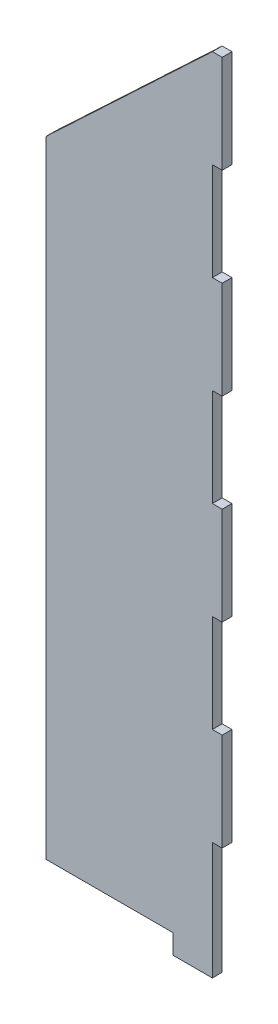
ISO-10303-21;
HEADER;
FILE_DESCRIPTION(('STEP AP214'),'2;1');
FILE_NAME('part.step','',(''),(''),'','','');
FILE_SCHEMA(('AUTOMOTIVE_DESIGN { 1 0 10303 214 1 1 1 1 }'));
ENDSEC;
DATA;
#1=APPLICATION_CONTEXT('core data for automotive mechanical design processes');
#2=APPLICATION_PROTOCOL_DEFINITION('international standard','automotive_design',2000,#1);
#3=PRODUCT_CONTEXT('',#1,'mechanical');
#4=PRODUCT('Part','Part','',(#3));
#5=PRODUCT_RELATED_PRODUCT_CATEGORY('part','',(#4));
#6=PRODUCT_DEFINITION_FORMATION('','',#4);
#7=PRODUCT_DEFINITION_CONTEXT('part definition',#1,'design');
#8=PRODUCT_DEFINITION('design','',#6,#7);
#9=PRODUCT_DEFINITION_SHAPE('','',#8);
#10=(LENGTH_UNIT() NAMED_UNIT(*) SI_UNIT(.MILLI.,.METRE.));
#11=(NAMED_UNIT(*) PLANE_ANGLE_UNIT() SI_UNIT($,.RADIAN.));
#12=(NAMED_UNIT(*) SI_UNIT($,.STERADIAN.) SOLID_ANGLE_UNIT());
#13=UNCERTAINTY_MEASURE_WITH_UNIT(LENGTH_MEASURE(1.E-05),#10,'distance_accuracy_value','');
#14=(GEOMETRIC_REPRESENTATION_CONTEXT(3) GLOBAL_UNCERTAINTY_ASSIGNED_CONTEXT((#13)) GLOBAL_UNIT_ASSIGNED_CONTEXT((#10,
#11,#12)) REPRESENTATION_CONTEXT('',''));
#15=CARTESIAN_POINT('',(0.,0.,0.));
#16=DIRECTION('',(0.,0.,1.));
#17=DIRECTION('',(1.,0.,0.));
#18=AXIS2_PLACEMENT_3D('',#15,#16,#17);
#19=CARTESIAN_POINT('',(-5.55111512312574E-13,25.3999999999994,3.175));
#20=DIRECTION('',(0.,1.,0.));
#21=DIRECTION('',(-1.,0.,0.));
#22=AXIS2_PLACEMENT_3D('',#19,#20,#21);
#23=PLANE('',#22);
#24=DIRECTION('',(1.,0.,0.));
#25=VECTOR('',#24,1.);
#26=CARTESIAN_POINT('',(-5.55111512312574E-13,25.3999999999994,0.));
#27=LINE('',#26,#25);
#28=CARTESIAN_POINT('',(26.9875,25.4,0.));
#29=VERTEX_POINT('',#28);
#30=CARTESIAN_POINT('',(30.162500000001,25.4,0.));
#31=VERTEX_POINT('',#30);
#32=EDGE_CURVE('E307',#29,#31,#27,.T.);
#33=ORIENTED_EDGE('',*,*,#32,.F.);
#34=DIRECTION('',(0.,0.,-1.));
#35=VECTOR('',#34,1.);
#36=CARTESIAN_POINT('',(26.9875,25.4,3.175));
#37=LINE('',#36,#35);
#38=CARTESIAN_POINT('',(26.9875,25.4,3.175));
#39=VERTEX_POINT('',#38);
#40=EDGE_CURVE('E11',#39,#29,#37,.T.);
#41=ORIENTED_EDGE('',*,*,#40,.F.);
#42=DIRECTION('',(1.,0.,0.));
#43=VECTOR('',#42,1.);
#44=CARTESIAN_POINT('',(-5.55111512312574E-13,25.3999999999994,3.175));
#45=LINE('',#44,#43);
#46=CARTESIAN_POINT('',(30.162500000001,25.4,3.175));
#47=VERTEX_POINT('',#46);
#48=EDGE_CURVE('E246',#39,#47,#45,.T.);
#49=ORIENTED_EDGE('',*,*,#48,.T.);
#50=DIRECTION('',(0.,0.,-1.));
#51=VECTOR('',#50,1.);
#52=CARTESIAN_POINT('',(30.162500000001,25.4,3.175));
#53=LINE('',#52,#51);
#54=EDGE_CURVE('E50',#47,#31,#53,.T.);
#55=ORIENTED_EDGE('',*,*,#54,.T.);
#56=EDGE_LOOP('',(#33,#41,#49,#55));
#57=FACE_BOUND('',#56,.T.);
#58=ADVANCED_FACE('F34',(#57),#23,.T.);
#59=CARTESIAN_POINT('',(26.9875,0.,3.175));
#60=DIRECTION('',(1.,0.,0.));
#61=DIRECTION('',(0.,1.,0.));
#62=AXIS2_PLACEMENT_3D('',#59,#60,#61);
#63=PLANE('',#62);
#64=DIRECTION('',(0.,-1.,0.));
#65=VECTOR('',#64,1.);
#66=CARTESIAN_POINT('',(26.9875,0.,0.));
#67=LINE('',#66,#65);
#68=CARTESIAN_POINT('',(26.9875,57.15,0.));
#69=VERTEX_POINT('',#68);
#70=EDGE_CURVE('E301',#69,#29,#67,.T.);
#71=ORIENTED_EDGE('',*,*,#70,.F.);
#72=DIRECTION('',(0.,0.,-1.));
#73=VECTOR('',#72,1.);
#74=CARTESIAN_POINT('',(26.9875,57.15,3.175));
#75=LINE('',#74,#73);
#76=CARTESIAN_POINT('',(26.9875,57.15,3.175));
#77=VERTEX_POINT('',#76);
#78=EDGE_CURVE('E42',#77,#69,#75,.T.);
#79=ORIENTED_EDGE('',*,*,#78,.F.);
#80=DIRECTION('',(0.,-1.,0.));
#81=VECTOR('',#80,1.);
#82=CARTESIAN_POINT('',(26.9875,0.,3.175));
#83=LINE('',#82,#81);
#84=EDGE_CURVE('E243',#77,#39,#83,.T.);
#85=ORIENTED_EDGE('',*,*,#84,.T.);
#86=ORIENTED_EDGE('',*,*,#40,.T.);
#87=EDGE_LOOP('',(#71,#79,#85,#86));
#88=FACE_BOUND('',#87,.T.);
#89=ADVANCED_FACE('F306',(#88),#63,.T.);
#90=CARTESIAN_POINT('',(-7.49400541621988E-13,57.1499999999996,3.175));
#91=DIRECTION('',(0.,1.,0.));
#92=DIRECTION('',(-1.,0.,0.));
#93=AXIS2_PLACEMENT_3D('',#90,#91,#92);
#94=PLANE('',#93);
#95=DIRECTION('',(1.,0.,0.));
#96=VECTOR('',#95,1.);
#97=CARTESIAN_POINT('',(-7.49400541621988E-13,57.1499999999996,0.));
#98=LINE('',#97,#96);
#99=CARTESIAN_POINT('',(30.1625000000007,57.15,0.));
#100=VERTEX_POINT('',#99);
#101=EDGE_CURVE('E294',#69,#100,#98,.T.);
#102=ORIENTED_EDGE('',*,*,#101,.T.);
#103=DIRECTION('',(0.,0.,-1.));
#104=VECTOR('',#103,1.);
#105=CARTESIAN_POINT('',(30.1625000000007,57.15,3.175));
#106=LINE('',#105,#104);
#107=CARTESIAN_POINT('',(30.1625000000007,57.15,3.175));
#108=VERTEX_POINT('',#107);
#109=EDGE_CURVE('E287',#108,#100,#106,.T.);
#110=ORIENTED_EDGE('',*,*,#109,.F.);
#111=DIRECTION('',(1.,0.,0.));
#112=VECTOR('',#111,1.);
#113=CARTESIAN_POINT('',(-7.49400541621988E-13,57.1499999999996,3.175));
#114=LINE('',#113,#112);
#115=EDGE_CURVE('E241',#77,#108,#114,.T.);
#116=ORIENTED_EDGE('',*,*,#115,.F.);
#117=ORIENTED_EDGE('',*,*,#78,.T.);
#118=EDGE_LOOP('',(#102,#110,#116,#117));
#119=FACE_BOUND('',#118,.T.);
#120=ADVANCED_FACE('F292',(#119),#94,.F.);
#121=CARTESIAN_POINT('',(30.1625000000007,0.,3.175));
#122=DIRECTION('',(1.,0.,0.));
#123=DIRECTION('',(0.,1.,0.));
#124=AXIS2_PLACEMENT_3D('',#121,#122,#123);
#125=PLANE('',#124);
#126=DIRECTION('',(0.,-1.,0.));
#127=VECTOR('',#126,1.);
#128=CARTESIAN_POINT('',(30.1625000000007,0.,0.));
#129=LINE('',#128,#127);
#130=CARTESIAN_POINT('',(30.1625000000003,88.9,0.));
#131=VERTEX_POINT('',#130);
#132=EDGE_CURVE('E304',#131,#100,#129,.T.);
#133=ORIENTED_EDGE('',*,*,#132,.F.);
#134=DIRECTION('',(0.,0.,-1.));
#135=VECTOR('',#134,1.);
#136=CARTESIAN_POINT('',(30.1625000000003,88.9,3.175));
#137=LINE('',#136,#135);
#138=CARTESIAN_POINT('',(30.1625000000003,88.9,3.175));
#139=VERTEX_POINT('',#138);
#140=EDGE_CURVE('E285',#139,#131,#137,.T.);
#141=ORIENTED_EDGE('',*,*,#140,.F.);
#142=DIRECTION('',(0.,-1.,0.));
#143=VECTOR('',#142,1.);
#144=CARTESIAN_POINT('',(30.1625000000007,0.,3.175));
#145=LINE('',#144,#143);
#146=EDGE_CURVE('E238',#139,#108,#145,.T.);
#147=ORIENTED_EDGE('',*,*,#146,.T.);
#148=ORIENTED_EDGE('',*,*,#109,.T.);
#149=EDGE_LOOP('',(#133,#141,#147,#148));
#150=FACE_BOUND('',#149,.T.);
#151=ADVANCED_FACE('F405',(#150),#125,.T.);
#152=CARTESIAN_POINT('',(-3.88578058618811E-13,88.8999999999999,3.175));
#153=DIRECTION('',(0.,1.,0.));
#154=DIRECTION('',(-1.,0.,0.));
#155=AXIS2_PLACEMENT_3D('',#152,#153,#154);
#156=PLANE('',#155);
#157=DIRECTION('',(1.,0.,0.));
#158=VECTOR('',#157,1.);
#159=CARTESIAN_POINT('',(-3.88578058618811E-13,88.8999999999999,0.));
#160=LINE('',#159,#158);
#161=CARTESIAN_POINT('',(26.9875,88.9,0.));
#162=VERTEX_POINT('',#161);
#163=EDGE_CURVE('E313',#162,#131,#160,.T.);
#164=ORIENTED_EDGE('',*,*,#163,.F.);
#165=DIRECTION('',(0.,0.,-1.));
#166=VECTOR('',#165,1.);
#167=CARTESIAN_POINT('',(26.9875,88.9,3.175));
#168=LINE('',#167,#166);
#169=CARTESIAN_POINT('',(26.9875,88.9,3.175));
#170=VERTEX_POINT('',#169);
#171=EDGE_CURVE('E283',#170,#162,#168,.T.);
#172=ORIENTED_EDGE('',*,*,#171,.F.);
#173=DIRECTION('',(1.,0.,0.));
#174=VECTOR('',#173,1.);
#175=CARTESIAN_POINT('',(-3.88578058618811E-13,88.8999999999999,3.175));
#176=LINE('',#175,#174);
#177=EDGE_CURVE('E235',#170,#139,#176,.T.);
#178=ORIENTED_EDGE('',*,*,#177,.T.);
#179=ORIENTED_EDGE('',*,*,#140,.T.);
#180=EDGE_LOOP('',(#164,#172,#178,#179));
#181=FACE_BOUND('',#180,.T.);
#182=ADVANCED_FACE('F402',(#181),#156,.T.);
#183=CARTESIAN_POINT('',(26.9875,120.65,0.));
#184=VERTEX_POINT('',#183);
#185=EDGE_CURVE('E309',#184,#162,#67,.T.);
#186=ORIENTED_EDGE('',*,*,#185,.F.);
#187=DIRECTION('',(0.,0.,-1.));
#188=VECTOR('',#187,1.);
#189=CARTESIAN_POINT('',(26.9875,120.65,3.175));
#190=LINE('',#189,#188);
#191=CARTESIAN_POINT('',(26.9875,120.65,3.175));
#192=VERTEX_POINT('',#191);
#193=EDGE_CURVE('E281',#192,#184,#190,.T.);
#194=ORIENTED_EDGE('',*,*,#193,.F.);
#195=EDGE_CURVE('E234',#192,#170,#83,.T.);
#196=ORIENTED_EDGE('',*,*,#195,.T.);
#197=ORIENTED_EDGE('',*,*,#171,.T.);
#198=EDGE_LOOP('',(#186,#194,#196,#197));
#199=FACE_BOUND('',#198,.T.);
#200=ADVANCED_FACE('F396',(#199),#63,.T.);
#201=CARTESIAN_POINT('',(-2.6367796834852E-12,120.649999999999,3.175));
#202=DIRECTION('',(0.,1.,0.));
#203=DIRECTION('',(-1.,0.,0.));
#204=AXIS2_PLACEMENT_3D('',#201,#202,#203);
#205=PLANE('',#204);
#206=DIRECTION('',(1.,0.,0.));
#207=VECTOR('',#206,1.);
#208=CARTESIAN_POINT('',(-2.6367796834852E-12,120.649999999999,0.));
#209=LINE('',#208,#207);
#210=CARTESIAN_POINT('',(30.1625,120.65,0.));
#211=VERTEX_POINT('',#210);
#212=EDGE_CURVE('E312',#184,#211,#209,.T.);
#213=ORIENTED_EDGE('',*,*,#212,.T.);
#214=DIRECTION('',(0.,0.,-1.));
#215=VECTOR('',#214,1.);
#216=CARTESIAN_POINT('',(30.1625,120.65,3.175));
#217=LINE('',#216,#215);
#218=CARTESIAN_POINT('',(30.1625,120.65,3.175));
#219=VERTEX_POINT('',#218);
#220=EDGE_CURVE('E279',#219,#211,#217,.T.);
#221=ORIENTED_EDGE('',*,*,#220,.F.);
#222=DIRECTION('',(1.,0.,0.));
#223=VECTOR('',#222,1.);
#224=CARTESIAN_POINT('',(-2.6367796834852E-12,120.649999999999,3.175));
#225=LINE('',#224,#223);
#226=EDGE_CURVE('E232',#192,#219,#225,.T.);
#227=ORIENTED_EDGE('',*,*,#226,.F.);
#228=ORIENTED_EDGE('',*,*,#193,.T.);
#229=EDGE_LOOP('',(#213,#221,#227,#228));
#230=FACE_BOUND('',#229,.T.);
#231=ADVANCED_FACE('F429',(#230),#205,.F.);
#232=CARTESIAN_POINT('',(30.1625,0.,3.175));
#233=DIRECTION('',(1.,0.,0.));
#234=DIRECTION('',(0.,1.,0.));
#235=AXIS2_PLACEMENT_3D('',#232,#233,#234);
#236=PLANE('',#235);
#237=DIRECTION('',(0.,-1.,0.));
#238=VECTOR('',#237,1.);
#239=CARTESIAN_POINT('',(30.1625,0.,0.));
#240=LINE('',#239,#238);
#241=CARTESIAN_POINT('',(30.1625,152.4,0.));
#242=VERTEX_POINT('',#241);
#243=EDGE_CURVE('E317',#242,#211,#240,.T.);
#244=ORIENTED_EDGE('',*,*,#243,.F.);
#245=DIRECTION('',(0.,0.,-1.));
#246=VECTOR('',#245,1.);
#247=CARTESIAN_POINT('',(30.1625,152.4,3.175));
#248=LINE('',#247,#246);
#249=CARTESIAN_POINT('',(30.1625,152.4,3.175));
#250=VERTEX_POINT('',#249);
#251=EDGE_CURVE('E277',#250,#242,#248,.T.);
#252=ORIENTED_EDGE('',*,*,#251,.F.);
#253=DIRECTION('',(0.,-1.,0.));
#254=VECTOR('',#253,1.);
#255=CARTESIAN_POINT('',(30.1625,0.,3.175));
#256=LINE('',#255,#254);
#257=EDGE_CURVE('E229',#250,#219,#256,.T.);
#258=ORIENTED_EDGE('',*,*,#257,.T.);
#259=ORIENTED_EDGE('',*,*,#220,.T.);
#260=EDGE_LOOP('',(#244,#252,#258,#259));
#261=FACE_BOUND('',#260,.T.);
#262=ADVANCED_FACE('F392',(#261),#236,.T.);
#263=CARTESIAN_POINT('',(0.,152.4,3.175));
#264=DIRECTION('',(0.,1.,0.));
#265=DIRECTION('',(0.,0.,1.));
#266=AXIS2_PLACEMENT_3D('',#263,#264,#265);
#267=PLANE('',#266);
#268=DIRECTION('',(1.,0.,0.));
#269=VECTOR('',#268,1.);
#270=CARTESIAN_POINT('',(0.,152.4,0.));
#271=LINE('',#270,#269);
#272=CARTESIAN_POINT('',(26.9875,152.4,0.));
#273=VERTEX_POINT('',#272);
#274=EDGE_CURVE('E325',#273,#242,#271,.T.);
#275=ORIENTED_EDGE('',*,*,#274,.F.);
#276=DIRECTION('',(0.,0.,-1.));
#277=VECTOR('',#276,1.);
#278=CARTESIAN_POINT('',(26.9875,152.4,3.175));
#279=LINE('',#278,#277);
#280=CARTESIAN_POINT('',(26.9875,152.4,3.175));
#281=VERTEX_POINT('',#280);
#282=EDGE_CURVE('E275',#281,#273,#279,.T.);
#283=ORIENTED_EDGE('',*,*,#282,.F.);
#284=DIRECTION('',(1.,0.,0.));
#285=VECTOR('',#284,1.);
#286=CARTESIAN_POINT('',(0.,152.4,3.175));
#287=LINE('',#286,#285);
#288=EDGE_CURVE('E226',#281,#250,#287,.T.);
#289=ORIENTED_EDGE('',*,*,#288,.T.);
#290=ORIENTED_EDGE('',*,*,#251,.T.);
#291=EDGE_LOOP('',(#275,#283,#289,#290));
#292=FACE_BOUND('',#291,.T.);
#293=ADVANCED_FACE('F388',(#292),#267,.T.);
#294=CARTESIAN_POINT('',(-63.3834862385321,67.3449541284404,3.175));
#295=DIRECTION('',(-0.685364699004991,0.728199992692803,0.));
#296=DIRECTION('',(-0.728199992692803,-0.685364699004991,0.));
#297=AXIS2_PLACEMENT_3D('',#294,#295,#296);
#298=PLANE('',#297);
#299=DIRECTION('',(0.728199992692803,0.685364699004991,0.));
#300=VECTOR('',#299,1.);
#301=CARTESIAN_POINT('',(-63.3834862385321,67.3449541284404,0.));
#302=LINE('',#301,#300);
#303=CARTESIAN_POINT('',(-26.9875,101.6,0.));
#304=VERTEX_POINT('',#303);
#305=EDGE_CURVE('E328',#304,#273,#302,.T.);
#306=ORIENTED_EDGE('',*,*,#305,.F.);
#307=DIRECTION('',(0.,0.,-1.));
#308=VECTOR('',#307,1.);
#309=CARTESIAN_POINT('',(-26.9875,101.6,3.175));
#310=LINE('',#309,#308);
#311=CARTESIAN_POINT('',(-26.9875,101.6,3.175));
#312=VERTEX_POINT('',#311);
#313=EDGE_CURVE('E273',#312,#304,#310,.T.);
#314=ORIENTED_EDGE('',*,*,#313,.F.);
#315=DIRECTION('',(0.728199992692803,0.685364699004991,0.));
#316=VECTOR('',#315,1.);
#317=CARTESIAN_POINT('',(-63.3834862385321,67.3449541284404,3.175));
#318=LINE('',#317,#316);
#319=EDGE_CURVE('E223',#312,#281,#318,.T.);
#320=ORIENTED_EDGE('',*,*,#319,.T.);
#321=ORIENTED_EDGE('',*,*,#282,.T.);
#322=EDGE_LOOP('',(#306,#314,#320,#321));
#323=FACE_BOUND('',#322,.T.);
#324=ADVANCED_FACE('F384',(#323),#298,.T.);
#325=CARTESIAN_POINT('',(-26.9875,0.,3.175));
#326=DIRECTION('',(-1.,0.,0.));
#327=DIRECTION('',(0.,-1.,0.));
#328=AXIS2_PLACEMENT_3D('',#325,#326,#327);
#329=PLANE('',#328);
#330=DIRECTION('',(0.,1.,0.));
#331=VECTOR('',#330,1.);
#332=CARTESIAN_POINT('',(-26.9875,0.,0.));
#333=LINE('',#332,#331);
#334=CARTESIAN_POINT('',(-26.9875,-101.6,0.));
#335=VERTEX_POINT('',#334);
#336=EDGE_CURVE('E331',#335,#304,#333,.T.);
#337=ORIENTED_EDGE('',*,*,#336,.F.);
#338=DIRECTION('',(0.,0.,-1.));
#339=VECTOR('',#338,1.);
#340=CARTESIAN_POINT('',(-26.9875,-101.6,3.175));
#341=LINE('',#340,#339);
#342=CARTESIAN_POINT('',(-26.9875,-101.6,3.175));
#343=VERTEX_POINT('',#342);
#344=EDGE_CURVE('E271',#343,#335,#341,.T.);
#345=ORIENTED_EDGE('',*,*,#344,.F.);
#346=DIRECTION('',(0.,1.,0.));
#347=VECTOR('',#346,1.);
#348=CARTESIAN_POINT('',(-26.9875,0.,3.175));
#349=LINE('',#348,#347);
#350=EDGE_CURVE('E220',#343,#312,#349,.T.);
#351=ORIENTED_EDGE('',*,*,#350,.T.);
#352=ORIENTED_EDGE('',*,*,#313,.T.);
#353=EDGE_LOOP('',(#337,#345,#351,#352));
#354=FACE_BOUND('',#353,.T.);
#355=ADVANCED_FACE('F380',(#354),#329,.T.);
#356=CARTESIAN_POINT('',(1.30614473485313E-13,-101.6,3.175));
#357=DIRECTION('',(0.,-1.,0.));
#358=DIRECTION('',(1.,0.,0.));
#359=AXIS2_PLACEMENT_3D('',#356,#357,#358);
#360=PLANE('',#359);
#361=DIRECTION('',(-1.,0.,0.));
#362=VECTOR('',#361,1.);
#363=CARTESIAN_POINT('',(1.30614473485313E-13,-101.6,0.));
#364=LINE('',#363,#362);
#365=CARTESIAN_POINT('',(14.2875,-101.6,0.));
#366=VERTEX_POINT('',#365);
#367=EDGE_CURVE('E334',#366,#335,#364,.T.);
#368=ORIENTED_EDGE('',*,*,#367,.F.);
#369=DIRECTION('',(0.,0.,-1.));
#370=VECTOR('',#369,1.);
#371=CARTESIAN_POINT('',(14.2875,-101.6,3.175));
#372=LINE('',#371,#370);
#373=CARTESIAN_POINT('',(14.2875,-101.6,3.175));
#374=VERTEX_POINT('',#373);
#375=EDGE_CURVE('E269',#374,#366,#372,.T.);
#376=ORIENTED_EDGE('',*,*,#375,.F.);
#377=DIRECTION('',(-1.,0.,0.));
#378=VECTOR('',#377,1.);
#379=CARTESIAN_POINT('',(1.30614473485313E-13,-101.6,3.175));
#380=LINE('',#379,#378);
#381=EDGE_CURVE('E215',#374,#343,#380,.T.);
#382=ORIENTED_EDGE('',*,*,#381,.T.);
#383=ORIENTED_EDGE('',*,*,#344,.T.);
#384=EDGE_LOOP('',(#368,#376,#382,#383));
#385=FACE_BOUND('',#384,.T.);
#386=ADVANCED_FACE('F374',(#385),#360,.T.);
#387=CARTESIAN_POINT('',(14.2875000000001,0.,3.175));
#388=DIRECTION('',(1.,0.,0.));
#389=DIRECTION('',(0.,1.,0.));
#390=AXIS2_PLACEMENT_3D('',#387,#388,#389);
#391=PLANE('',#390);
#392=DIRECTION('',(0.,-1.,0.));
#393=VECTOR('',#392,1.);
#394=CARTESIAN_POINT('',(14.2875000000001,0.,0.));
#395=LINE('',#394,#393);
#396=CARTESIAN_POINT('',(14.2875,-107.95,0.));
#397=VERTEX_POINT('',#396);
#398=EDGE_CURVE('E337',#366,#397,#395,.T.);
#399=ORIENTED_EDGE('',*,*,#398,.T.);
#400=DIRECTION('',(0.,0.,-1.));
#401=VECTOR('',#400,1.);
#402=CARTESIAN_POINT('',(14.2875,-107.95,3.175));
#403=LINE('',#402,#401);
#404=CARTESIAN_POINT('',(14.2875,-107.95,3.175));
#405=VERTEX_POINT('',#404);
#406=EDGE_CURVE('E266',#405,#397,#403,.T.);
#407=ORIENTED_EDGE('',*,*,#406,.F.);
#408=DIRECTION('',(0.,-1.,0.));
#409=VECTOR('',#408,1.);
#410=CARTESIAN_POINT('',(14.2875000000001,0.,3.175));
#411=LINE('',#410,#409);
#412=EDGE_CURVE('E212',#374,#405,#411,.T.);
#413=ORIENTED_EDGE('',*,*,#412,.F.);
#414=ORIENTED_EDGE('',*,*,#375,.T.);
#415=EDGE_LOOP('',(#399,#407,#413,#414));
#416=FACE_BOUND('',#415,.T.);
#417=ADVANCED_FACE('F547',(#416),#391,.F.);
#418=CARTESIAN_POINT('',(0.,-107.95,3.175));
#419=DIRECTION('',(0.,1.,0.));
#420=DIRECTION('',(0.,0.,1.));
#421=AXIS2_PLACEMENT_3D('',#418,#419,#420);
#422=PLANE('',#421);
#423=DIRECTION('',(1.,0.,0.));
#424=VECTOR('',#423,1.);
#425=CARTESIAN_POINT('',(0.,-107.95,0.));
#426=LINE('',#425,#424);
#427=CARTESIAN_POINT('',(26.9875,-107.95,0.));
#428=VERTEX_POINT('',#427);
#429=EDGE_CURVE('E339',#397,#428,#426,.T.);
#430=ORIENTED_EDGE('',*,*,#429,.T.);
#431=DIRECTION('',(0.,0.,-1.));
#432=VECTOR('',#431,1.);
#433=CARTESIAN_POINT('',(26.9875,-107.95,3.175));
#434=LINE('',#433,#432);
#435=CARTESIAN_POINT('',(26.9875,-107.95,3.175));
#436=VERTEX_POINT('',#435);
#437=EDGE_CURVE('E264',#436,#428,#434,.T.);
#438=ORIENTED_EDGE('',*,*,#437,.F.);
#439=DIRECTION('',(1.,0.,0.));
#440=VECTOR('',#439,1.);
#441=CARTESIAN_POINT('',(0.,-107.95,3.175));
#442=LINE('',#441,#440);
#443=EDGE_CURVE('E209',#405,#436,#442,.T.);
#444=ORIENTED_EDGE('',*,*,#443,.F.);
#445=ORIENTED_EDGE('',*,*,#406,.T.);
#446=EDGE_LOOP('',(#430,#438,#444,#445));
#447=FACE_BOUND('',#446,.T.);
#448=ADVANCED_FACE('F368',(#447),#422,.F.);
#449=CARTESIAN_POINT('',(26.9875,0.,3.175));
#450=DIRECTION('',(1.,0.,0.));
#451=DIRECTION('',(0.,1.,0.));
#452=AXIS2_PLACEMENT_3D('',#449,#450,#451);
#453=PLANE('',#452);
#454=DIRECTION('',(0.,-1.,0.));
#455=VECTOR('',#454,1.);
#456=CARTESIAN_POINT('',(26.9875,0.,0.));
#457=LINE('',#456,#455);
#458=CARTESIAN_POINT('',(26.9875,-69.8500000000001,0.));
#459=VERTEX_POINT('',#458);
#460=EDGE_CURVE('E342',#459,#428,#457,.T.);
#461=ORIENTED_EDGE('',*,*,#460,.F.);
#462=DIRECTION('',(0.,0.,-1.));
#463=VECTOR('',#462,1.);
#464=CARTESIAN_POINT('',(26.9875,-69.8500000000001,3.175));
#465=LINE('',#464,#463);
#466=CARTESIAN_POINT('',(26.9875,-69.8500000000001,3.175));
#467=VERTEX_POINT('',#466);
#468=EDGE_CURVE('E262',#467,#459,#465,.T.);
#469=ORIENTED_EDGE('',*,*,#468,.F.);
#470=DIRECTION('',(0.,-1.,0.));
#471=VECTOR('',#470,1.);
#472=CARTESIAN_POINT('',(26.9875,0.,3.175));
#473=LINE('',#472,#471);
#474=EDGE_CURVE('E202',#467,#436,#473,.T.);
#475=ORIENTED_EDGE('',*,*,#474,.T.);
#476=ORIENTED_EDGE('',*,*,#437,.T.);
#477=EDGE_LOOP('',(#461,#469,#475,#476));
#478=FACE_BOUND('',#477,.T.);
#479=ADVANCED_FACE('F366',(#478),#453,.T.);
#480=CARTESIAN_POINT('',(3.35842464948908E-12,-69.8500000000014,3.175));
#481=DIRECTION('',(0.,1.,0.));
#482=DIRECTION('',(-1.,0.,0.));
#483=AXIS2_PLACEMENT_3D('',#480,#481,#482);
#484=PLANE('',#483);
#485=DIRECTION('',(1.,0.,0.));
#486=VECTOR('',#485,1.);
#487=CARTESIAN_POINT('',(3.35842464948908E-12,-69.8500000000014,0.));
#488=LINE('',#487,#486);
#489=CARTESIAN_POINT('',(30.162500000002,-69.8499999999999,0.));
#490=VERTEX_POINT('',#489);
#491=EDGE_CURVE('E345',#459,#490,#488,.T.);
#492=ORIENTED_EDGE('',*,*,#491,.T.);
#493=DIRECTION('',(0.,0.,-1.));
#494=VECTOR('',#493,1.);
#495=CARTESIAN_POINT('',(30.162500000002,-69.8499999999999,3.175));
#496=LINE('',#495,#494);
#497=CARTESIAN_POINT('',(30.162500000002,-69.8499999999999,3.175));
#498=VERTEX_POINT('',#497);
#499=EDGE_CURVE('E260',#498,#490,#496,.T.);
#500=ORIENTED_EDGE('',*,*,#499,.F.);
#501=DIRECTION('',(1.,0.,0.));
#502=VECTOR('',#501,1.);
#503=CARTESIAN_POINT('',(3.35842464948908E-12,-69.8500000000014,3.175));
#504=LINE('',#503,#502);
#505=EDGE_CURVE('E208',#467,#498,#504,.T.);
#506=ORIENTED_EDGE('',*,*,#505,.F.);
#507=ORIENTED_EDGE('',*,*,#468,.T.);
#508=EDGE_LOOP('',(#492,#500,#506,#507));
#509=FACE_BOUND('',#508,.T.);
#510=ADVANCED_FACE('F363',(#509),#484,.F.);
#511=CARTESIAN_POINT('',(30.162500000002,0.,3.175));
#512=DIRECTION('',(1.,0.,0.));
#513=DIRECTION('',(0.,1.,0.));
#514=AXIS2_PLACEMENT_3D('',#511,#512,#513);
#515=PLANE('',#514);
#516=DIRECTION('',(0.,-1.,0.));
#517=VECTOR('',#516,1.);
#518=CARTESIAN_POINT('',(30.162500000002,0.,0.));
#519=LINE('',#518,#517);
#520=CARTESIAN_POINT('',(30.1625000000017,-38.1,0.));
#521=VERTEX_POINT('',#520);
#522=EDGE_CURVE('E348',#521,#490,#519,.T.);
#523=ORIENTED_EDGE('',*,*,#522,.F.);
#524=DIRECTION('',(0.,0.,-1.));
#525=VECTOR('',#524,1.);
#526=CARTESIAN_POINT('',(30.1625000000017,-38.1,3.175));
#527=LINE('',#526,#525);
#528=CARTESIAN_POINT('',(30.1625000000017,-38.1,3.175));
#529=VERTEX_POINT('',#528);
#530=EDGE_CURVE('E258',#529,#521,#527,.T.);
#531=ORIENTED_EDGE('',*,*,#530,.F.);
#532=DIRECTION('',(0.,-1.,0.));
#533=VECTOR('',#532,1.);
#534=CARTESIAN_POINT('',(30.162500000002,0.,3.175));
#535=LINE('',#534,#533);
#536=EDGE_CURVE('E203',#529,#498,#535,.T.);
#537=ORIENTED_EDGE('',*,*,#536,.T.);
#538=ORIENTED_EDGE('',*,*,#499,.T.);
#539=EDGE_LOOP('',(#523,#531,#537,#538));
#540=FACE_BOUND('',#539,.T.);
#541=ADVANCED_FACE('F359',(#540),#515,.T.);
#542=CARTESIAN_POINT('',(1.16573417585646E-12,-38.1000000000009,3.175));
#543=DIRECTION('',(0.,1.,0.));
#544=DIRECTION('',(-1.,0.,0.));
#545=AXIS2_PLACEMENT_3D('',#542,#543,#544);
#546=PLANE('',#545);
#547=DIRECTION('',(1.,0.,0.));
#548=VECTOR('',#547,1.);
#549=CARTESIAN_POINT('',(1.16573417585646E-12,-38.1000000000009,0.));
#550=LINE('',#549,#548);
#551=CARTESIAN_POINT('',(26.9875,-38.1000000000001,0.));
#552=VERTEX_POINT('',#551);
#553=EDGE_CURVE('E350',#552,#521,#550,.T.);
#554=ORIENTED_EDGE('',*,*,#553,.F.);
#555=DIRECTION('',(0.,0.,-1.));
#556=VECTOR('',#555,1.);
#557=CARTESIAN_POINT('',(26.9875,-38.1000000000001,3.175));
#558=LINE('',#557,#556);
#559=CARTESIAN_POINT('',(26.9875,-38.1000000000001,3.175));
#560=VERTEX_POINT('',#559);
#561=EDGE_CURVE('E188',#560,#552,#558,.T.);
#562=ORIENTED_EDGE('',*,*,#561,.F.);
#563=DIRECTION('',(1.,0.,0.));
#564=VECTOR('',#563,1.);
#565=CARTESIAN_POINT('',(1.16573417585646E-12,-38.1000000000009,3.175));
#566=LINE('',#565,#564);
#567=EDGE_CURVE('E200',#560,#529,#566,.T.);
#568=ORIENTED_EDGE('',*,*,#567,.T.);
#569=ORIENTED_EDGE('',*,*,#530,.T.);
#570=EDGE_LOOP('',(#554,#562,#568,#569));
#571=FACE_BOUND('',#570,.T.);
#572=ADVANCED_FACE('F356',(#571),#546,.T.);
#573=CARTESIAN_POINT('',(26.9875,-6.35000000000005,0.));
#574=VERTEX_POINT('',#573);
#575=EDGE_CURVE('E185',#574,#552,#457,.T.);
#576=ORIENTED_EDGE('',*,*,#575,.F.);
#577=DIRECTION('',(0.,0.,-1.));
#578=VECTOR('',#577,1.);
#579=CARTESIAN_POINT('',(26.9875,-6.35000000000005,3.175));
#580=LINE('',#579,#578);
#581=CARTESIAN_POINT('',(26.9875,-6.35000000000005,3.175));
#582=VERTEX_POINT('',#581);
#583=EDGE_CURVE('E179',#582,#574,#580,.T.);
#584=ORIENTED_EDGE('',*,*,#583,.F.);
#585=EDGE_CURVE('E183',#582,#560,#473,.T.);
#586=ORIENTED_EDGE('',*,*,#585,.T.);
#587=ORIENTED_EDGE('',*,*,#561,.T.);
#588=EDGE_LOOP('',(#576,#584,#586,#587));
#589=FACE_BOUND('',#588,.T.);
#590=ADVANCED_FACE('F181',(#589),#453,.T.);
#591=CARTESIAN_POINT('',(1.94289029309432E-13,-6.35000000000088,3.175));
#592=DIRECTION('',(0.,1.,0.));
#593=DIRECTION('',(-1.,0.,0.));
#594=AXIS2_PLACEMENT_3D('',#591,#592,#593);
#595=PLANE('',#594);
#596=DIRECTION('',(1.,0.,0.));
#597=VECTOR('',#596,1.);
#598=CARTESIAN_POINT('',(1.94289029309432E-13,-6.35000000000088,0.));
#599=LINE('',#598,#597);
#600=CARTESIAN_POINT('',(30.1625000000013,-6.34999999999995,0.));
#601=VERTEX_POINT('',#600);
#602=EDGE_CURVE('E249',#574,#601,#599,.T.);
#603=ORIENTED_EDGE('',*,*,#602,.T.);
#604=DIRECTION('',(0.,0.,-1.));
#605=VECTOR('',#604,1.);
#606=CARTESIAN_POINT('',(30.1625000000013,-6.34999999999995,3.175));
#607=LINE('',#606,#605);
#608=CARTESIAN_POINT('',(30.1625000000013,-6.34999999999995,3.175));
#609=VERTEX_POINT('',#608);
#610=EDGE_CURVE('E115',#609,#601,#607,.T.);
#611=ORIENTED_EDGE('',*,*,#610,.F.);
#612=DIRECTION('',(1.,0.,0.));
#613=VECTOR('',#612,1.);
#614=CARTESIAN_POINT('',(1.94289029309432E-13,-6.35000000000088,3.175));
#615=LINE('',#614,#613);
#616=EDGE_CURVE('E190',#582,#609,#615,.T.);
#617=ORIENTED_EDGE('',*,*,#616,.F.);
#618=ORIENTED_EDGE('',*,*,#583,.T.);
#619=EDGE_LOOP('',(#603,#611,#617,#618));
#620=FACE_BOUND('',#619,.T.);
#621=ADVANCED_FACE('F191',(#620),#595,.F.);
#622=CARTESIAN_POINT('',(30.1625000000013,0.,3.175));
#623=DIRECTION('',(1.,0.,0.));
#624=DIRECTION('',(0.,1.,0.));
#625=AXIS2_PLACEMENT_3D('',#622,#623,#624);
#626=PLANE('',#625);
#627=DIRECTION('',(0.,-1.,0.));
#628=VECTOR('',#627,1.);
#629=CARTESIAN_POINT('',(30.1625000000013,0.,0.));
#630=LINE('',#629,#628);
#631=EDGE_CURVE('E247',#31,#601,#630,.T.);
#632=ORIENTED_EDGE('',*,*,#631,.F.);
#633=ORIENTED_EDGE('',*,*,#54,.F.);
#634=DIRECTION('',(0.,-1.,0.));
#635=VECTOR('',#634,1.);
#636=CARTESIAN_POINT('',(30.1625000000013,0.,3.175));
#637=LINE('',#636,#635);
#638=EDGE_CURVE('E194',#47,#609,#637,.T.);
#639=ORIENTED_EDGE('',*,*,#638,.T.);
#640=ORIENTED_EDGE('',*,*,#610,.T.);
#641=EDGE_LOOP('',(#632,#633,#639,#640));
#642=FACE_BOUND('',#641,.T.);
#643=ADVANCED_FACE('F408',(#642),#626,.T.);
#644=CARTESIAN_POINT('',(0.,0.,3.175));
#645=DIRECTION('',(0.,0.,1.));
#646=DIRECTION('',(1.,0.,0.));
#647=AXIS2_PLACEMENT_3D('',#644,#645,#646);
#648=PLANE('',#647);
#649=ORIENTED_EDGE('',*,*,#48,.F.);
#650=ORIENTED_EDGE('',*,*,#84,.F.);
#651=ORIENTED_EDGE('',*,*,#115,.T.);
#652=ORIENTED_EDGE('',*,*,#146,.F.);
#653=ORIENTED_EDGE('',*,*,#177,.F.);
#654=ORIENTED_EDGE('',*,*,#195,.F.);
#655=ORIENTED_EDGE('',*,*,#226,.T.);
#656=ORIENTED_EDGE('',*,*,#257,.F.);
#657=ORIENTED_EDGE('',*,*,#288,.F.);
#658=ORIENTED_EDGE('',*,*,#319,.F.);
#659=ORIENTED_EDGE('',*,*,#350,.F.);
#660=ORIENTED_EDGE('',*,*,#381,.F.);
#661=ORIENTED_EDGE('',*,*,#412,.T.);
#662=ORIENTED_EDGE('',*,*,#443,.T.);
#663=ORIENTED_EDGE('',*,*,#474,.F.);
#664=ORIENTED_EDGE('',*,*,#505,.T.);
#665=ORIENTED_EDGE('',*,*,#536,.F.);
#666=ORIENTED_EDGE('',*,*,#567,.F.);
#667=ORIENTED_EDGE('',*,*,#585,.F.);
#668=ORIENTED_EDGE('',*,*,#616,.T.);
#669=ORIENTED_EDGE('',*,*,#638,.F.);
#670=EDGE_LOOP('',(#649,#650,#651,#652,#653,#654,#655,#656,#657,#658,#659,#660,#661,#662,#663,
#664,#665,#666,#667,#668,#669));
#671=FACE_BOUND('',#670,.T.);
#672=ADVANCED_FACE('F197',(#671),#648,.T.);
#673=CARTESIAN_POINT('',(0.,0.,0.));
#674=DIRECTION('',(0.,0.,1.));
#675=DIRECTION('',(1.,0.,0.));
#676=AXIS2_PLACEMENT_3D('',#673,#674,#675);
#677=PLANE('',#676);
#678=ORIENTED_EDGE('',*,*,#32,.T.);
#679=ORIENTED_EDGE('',*,*,#631,.T.);
#680=ORIENTED_EDGE('',*,*,#602,.F.);
#681=ORIENTED_EDGE('',*,*,#575,.T.);
#682=ORIENTED_EDGE('',*,*,#553,.T.);
#683=ORIENTED_EDGE('',*,*,#522,.T.);
#684=ORIENTED_EDGE('',*,*,#491,.F.);
#685=ORIENTED_EDGE('',*,*,#460,.T.);
#686=ORIENTED_EDGE('',*,*,#429,.F.);
#687=ORIENTED_EDGE('',*,*,#398,.F.);
#688=ORIENTED_EDGE('',*,*,#367,.T.);
#689=ORIENTED_EDGE('',*,*,#336,.T.);
#690=ORIENTED_EDGE('',*,*,#305,.T.);
#691=ORIENTED_EDGE('',*,*,#274,.T.);
#692=ORIENTED_EDGE('',*,*,#243,.T.);
#693=ORIENTED_EDGE('',*,*,#212,.F.);
#694=ORIENTED_EDGE('',*,*,#185,.T.);
#695=ORIENTED_EDGE('',*,*,#163,.T.);
#696=ORIENTED_EDGE('',*,*,#132,.T.);
#697=ORIENTED_EDGE('',*,*,#101,.F.);
#698=ORIENTED_EDGE('',*,*,#70,.T.);
#699=EDGE_LOOP('',(#678,#679,#680,#681,#682,#683,#684,#685,#686,#687,#688,#689,#690,#691,#692,
#693,#694,#695,#696,#697,#698));
#700=FACE_BOUND('',#699,.T.);
#701=ADVANCED_FACE('F300',(#700),#677,.F.);
#702=CLOSED_SHELL('',(#58,#89,#120,#151,#182,#200,#231,#262,#293,#324,#355,#386,#417,#448,#479,
#510,#541,#572,#590,#621,#643,#672,#701));
#703=MANIFOLD_SOLID_BREP('B2',#702);
#704=ADVANCED_BREP_SHAPE_REPRESENTATION('',(#18,#703),#14);
#705=SHAPE_DEFINITION_REPRESENTATION(#9,#704);
ENDSEC;
END-ISO-10303-21;
